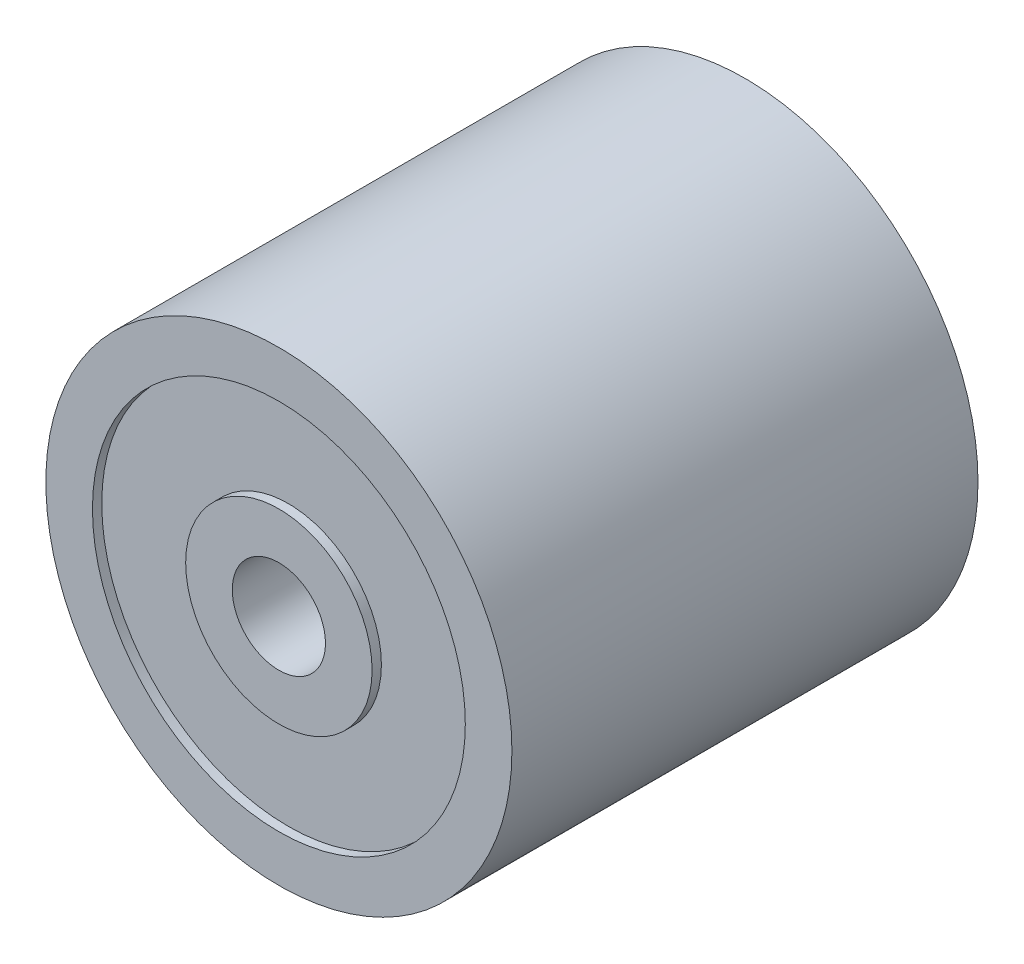
ISO-10303-21;
HEADER;
FILE_DESCRIPTION(('STEP AP214'),'2;1');
FILE_NAME('part.step','',(''),(''),'','','');
FILE_SCHEMA(('AUTOMOTIVE_DESIGN { 1 0 10303 214 1 1 1 1 }'));
ENDSEC;
DATA;
#1=APPLICATION_CONTEXT('core data for automotive mechanical design processes');
#2=APPLICATION_PROTOCOL_DEFINITION('international standard','automotive_design',2000,#1);
#3=PRODUCT_CONTEXT('',#1,'mechanical');
#4=PRODUCT('Part','Part','',(#3));
#5=PRODUCT_RELATED_PRODUCT_CATEGORY('part','',(#4));
#6=PRODUCT_DEFINITION_FORMATION('','',#4);
#7=PRODUCT_DEFINITION_CONTEXT('part definition',#1,'design');
#8=PRODUCT_DEFINITION('design','',#6,#7);
#9=PRODUCT_DEFINITION_SHAPE('','',#8);
#10=(LENGTH_UNIT() NAMED_UNIT(*) SI_UNIT(.MILLI.,.METRE.));
#11=(NAMED_UNIT(*) PLANE_ANGLE_UNIT() SI_UNIT($,.RADIAN.));
#12=(NAMED_UNIT(*) SI_UNIT($,.STERADIAN.) SOLID_ANGLE_UNIT());
#13=UNCERTAINTY_MEASURE_WITH_UNIT(LENGTH_MEASURE(1.E-05),#10,'distance_accuracy_value','');
#14=(GEOMETRIC_REPRESENTATION_CONTEXT(3) GLOBAL_UNCERTAINTY_ASSIGNED_CONTEXT((#13)) GLOBAL_UNIT_ASSIGNED_CONTEXT((#10,
#11,#12)) REPRESENTATION_CONTEXT('',''));
#15=CARTESIAN_POINT('',(0.,0.,0.));
#16=DIRECTION('',(0.,0.,1.));
#17=DIRECTION('',(1.,0.,0.));
#18=AXIS2_PLACEMENT_3D('',#15,#16,#17);
#19=CARTESIAN_POINT('',(0.,0.,0.));
#20=DIRECTION('',(0.,0.,1.));
#21=DIRECTION('',(1.,0.,0.));
#22=AXIS2_PLACEMENT_3D('',#19,#20,#21);
#23=PLANE('',#22);
#24=CARTESIAN_POINT('',(0.,0.,0.));
#25=DIRECTION('',(0.,0.,1.));
#26=DIRECTION('',(1.,0.,0.));
#27=AXIS2_PLACEMENT_3D('',#24,#25,#26);
#28=CIRCLE('',#27,1.27);
#29=CARTESIAN_POINT('',(1.27,0.,0.));
#30=VERTEX_POINT('',#29);
#31=EDGE_CURVE('E46',#30,#30,#28,.T.);
#32=ORIENTED_EDGE('',*,*,#31,.T.);
#33=EDGE_LOOP('',(#32));
#34=FACE_BOUND('',#33,.T.);
#35=CARTESIAN_POINT('',(0.,0.,0.));
#36=DIRECTION('',(0.,0.,1.));
#37=DIRECTION('',(1.,0.,0.));
#38=AXIS2_PLACEMENT_3D('',#35,#36,#37);
#39=CIRCLE('',#38,2.54);
#40=CARTESIAN_POINT('',(2.54,0.,0.));
#41=VERTEX_POINT('',#40);
#42=EDGE_CURVE('E68',#41,#41,#39,.T.);
#43=ORIENTED_EDGE('',*,*,#42,.F.);
#44=EDGE_LOOP('',(#43));
#45=FACE_BOUND('',#44,.T.);
#46=ADVANCED_FACE('F33',(#34,#45),#23,.F.);
#47=CARTESIAN_POINT('',(0.,0.,12.7));
#48=DIRECTION('',(0.,0.,1.));
#49=DIRECTION('',(1.,0.,0.));
#50=AXIS2_PLACEMENT_3D('',#47,#48,#49);
#51=PLANE('',#50);
#52=CARTESIAN_POINT('',(0.,0.,12.7));
#53=DIRECTION('',(0.,0.,1.));
#54=DIRECTION('',(1.,0.,0.));
#55=AXIS2_PLACEMENT_3D('',#52,#53,#54);
#56=CIRCLE('',#55,1.27);
#57=CARTESIAN_POINT('',(1.27,0.,12.7));
#58=VERTEX_POINT('',#57);
#59=EDGE_CURVE('E44',#58,#58,#56,.T.);
#60=ORIENTED_EDGE('',*,*,#59,.F.);
#61=EDGE_LOOP('',(#60));
#62=FACE_BOUND('',#61,.T.);
#63=CARTESIAN_POINT('',(0.,0.,12.7));
#64=DIRECTION('',(0.,0.,1.));
#65=DIRECTION('',(1.,0.,0.));
#66=AXIS2_PLACEMENT_3D('',#63,#64,#65);
#67=CIRCLE('',#66,2.54);
#68=CARTESIAN_POINT('',(2.54,0.,12.7));
#69=VERTEX_POINT('',#68);
#70=EDGE_CURVE('E56',#69,#69,#67,.T.);
#71=ORIENTED_EDGE('',*,*,#70,.T.);
#72=EDGE_LOOP('',(#71));
#73=FACE_BOUND('',#72,.T.);
#74=ADVANCED_FACE('F88',(#62,#73),#51,.T.);
#75=CARTESIAN_POINT('',(0.,0.,12.7));
#76=DIRECTION('',(0.,0.,1.));
#77=DIRECTION('',(1.,0.,0.));
#78=AXIS2_PLACEMENT_3D('',#75,#76,#77);
#79=CIRCLE('',#78,5.08);
#80=CARTESIAN_POINT('',(5.08,0.,12.7));
#81=VERTEX_POINT('',#80);
#82=EDGE_CURVE('E52',#81,#81,#79,.T.);
#83=ORIENTED_EDGE('',*,*,#82,.F.);
#84=EDGE_LOOP('',(#83));
#85=FACE_BOUND('',#84,.T.);
#86=CARTESIAN_POINT('',(0.,0.,12.7));
#87=DIRECTION('',(0.,0.,1.));
#88=DIRECTION('',(1.,0.,0.));
#89=AXIS2_PLACEMENT_3D('',#86,#87,#88);
#90=CIRCLE('',#89,6.35);
#91=CARTESIAN_POINT('',(6.35,0.,12.7));
#92=VERTEX_POINT('',#91);
#93=EDGE_CURVE('E10',#92,#92,#90,.T.);
#94=ORIENTED_EDGE('',*,*,#93,.T.);
#95=EDGE_LOOP('',(#94));
#96=FACE_BOUND('',#95,.T.);
#97=ADVANCED_FACE('F94',(#85,#96),#51,.T.);
#98=CARTESIAN_POINT('',(0.,0.,0.));
#99=DIRECTION('',(0.,0.,1.));
#100=DIRECTION('',(1.,0.,0.));
#101=AXIS2_PLACEMENT_3D('',#98,#99,#100);
#102=CIRCLE('',#101,5.08);
#103=CARTESIAN_POINT('',(5.08,0.,0.));
#104=VERTEX_POINT('',#103);
#105=EDGE_CURVE('E64',#104,#104,#102,.T.);
#106=ORIENTED_EDGE('',*,*,#105,.T.);
#107=EDGE_LOOP('',(#106));
#108=FACE_BOUND('',#107,.T.);
#109=CARTESIAN_POINT('',(0.,0.,0.));
#110=DIRECTION('',(0.,0.,1.));
#111=DIRECTION('',(1.,0.,0.));
#112=AXIS2_PLACEMENT_3D('',#109,#110,#111);
#113=CIRCLE('',#112,6.35);
#114=CARTESIAN_POINT('',(6.35,0.,0.));
#115=VERTEX_POINT('',#114);
#116=EDGE_CURVE('E37',#115,#115,#113,.T.);
#117=ORIENTED_EDGE('',*,*,#116,.F.);
#118=EDGE_LOOP('',(#117));
#119=FACE_BOUND('',#118,.T.);
#120=ADVANCED_FACE('F90',(#108,#119),#23,.F.);
#121=CARTESIAN_POINT('',(0.,0.,12.7));
#122=DIRECTION('',(0.,0.,-1.));
#123=DIRECTION('',(-1.,0.,0.));
#124=AXIS2_PLACEMENT_3D('',#121,#122,#123);
#125=CYLINDRICAL_SURFACE('',#124,6.35);
#126=ORIENTED_EDGE('',*,*,#93,.F.);
#127=EDGE_LOOP('',(#126));
#128=FACE_BOUND('',#127,.T.);
#129=ORIENTED_EDGE('',*,*,#116,.T.);
#130=EDGE_LOOP('',(#129));
#131=FACE_BOUND('',#130,.T.);
#132=ADVANCED_FACE('F35',(#128,#131),#125,.T.);
#133=CARTESIAN_POINT('',(0.,0.,12.7));
#134=DIRECTION('',(0.,0.,-1.));
#135=DIRECTION('',(-1.,0.,0.));
#136=AXIS2_PLACEMENT_3D('',#133,#134,#135);
#137=CYLINDRICAL_SURFACE('',#136,1.27);
#138=ORIENTED_EDGE('',*,*,#59,.T.);
#139=EDGE_LOOP('',(#138));
#140=FACE_BOUND('',#139,.T.);
#141=ORIENTED_EDGE('',*,*,#31,.F.);
#142=EDGE_LOOP('',(#141));
#143=FACE_BOUND('',#142,.T.);
#144=ADVANCED_FACE('F103',(#140,#143),#137,.F.);
#145=CARTESIAN_POINT('',(0.,0.,12.446));
#146=DIRECTION('',(0.,0.,1.));
#147=DIRECTION('',(1.,0.,0.));
#148=AXIS2_PLACEMENT_3D('',#145,#146,#147);
#149=CYLINDRICAL_SURFACE('',#148,2.54);
#150=CARTESIAN_POINT('',(0.,0.,12.446));
#151=DIRECTION('',(0.,0.,1.));
#152=DIRECTION('',(1.,0.,0.));
#153=AXIS2_PLACEMENT_3D('',#150,#151,#152);
#154=CIRCLE('',#153,2.54);
#155=CARTESIAN_POINT('',(2.54,0.,12.446));
#156=VERTEX_POINT('',#155);
#157=EDGE_CURVE('E55',#156,#156,#154,.T.);
#158=ORIENTED_EDGE('',*,*,#157,.T.);
#159=EDGE_LOOP('',(#158));
#160=FACE_BOUND('',#159,.T.);
#161=ORIENTED_EDGE('',*,*,#70,.F.);
#162=EDGE_LOOP('',(#161));
#163=FACE_BOUND('',#162,.T.);
#164=ADVANCED_FACE('F125',(#160,#163),#149,.T.);
#165=CARTESIAN_POINT('',(0.,0.,12.446));
#166=DIRECTION('',(0.,0.,1.));
#167=DIRECTION('',(1.,0.,0.));
#168=AXIS2_PLACEMENT_3D('',#165,#166,#167);
#169=CYLINDRICAL_SURFACE('',#168,5.08);
#170=CARTESIAN_POINT('',(0.,0.,12.446));
#171=DIRECTION('',(0.,0.,1.));
#172=DIRECTION('',(1.,0.,0.));
#173=AXIS2_PLACEMENT_3D('',#170,#171,#172);
#174=CIRCLE('',#173,5.08);
#175=CARTESIAN_POINT('',(5.08,0.,12.446));
#176=VERTEX_POINT('',#175);
#177=EDGE_CURVE('E49',#176,#176,#174,.T.);
#178=ORIENTED_EDGE('',*,*,#177,.F.);
#179=EDGE_LOOP('',(#178));
#180=FACE_BOUND('',#179,.T.);
#181=ORIENTED_EDGE('',*,*,#82,.T.);
#182=EDGE_LOOP('',(#181));
#183=FACE_BOUND('',#182,.T.);
#184=ADVANCED_FACE('F121',(#180,#183),#169,.F.);
#185=CARTESIAN_POINT('',(0.,0.,12.446));
#186=DIRECTION('',(0.,0.,1.));
#187=DIRECTION('',(1.,0.,0.));
#188=AXIS2_PLACEMENT_3D('',#185,#186,#187);
#189=PLANE('',#188);
#190=ORIENTED_EDGE('',*,*,#157,.F.);
#191=EDGE_LOOP('',(#190));
#192=FACE_BOUND('',#191,.T.);
#193=ORIENTED_EDGE('',*,*,#177,.T.);
#194=EDGE_LOOP('',(#193));
#195=FACE_BOUND('',#194,.T.);
#196=ADVANCED_FACE('F83',(#192,#195),#189,.T.);
#197=CARTESIAN_POINT('',(0.,0.,0.254));
#198=DIRECTION('',(0.,0.,-1.));
#199=DIRECTION('',(-1.,0.,0.));
#200=AXIS2_PLACEMENT_3D('',#197,#198,#199);
#201=CYLINDRICAL_SURFACE('',#200,2.54);
#202=CARTESIAN_POINT('',(0.,0.,0.254));
#203=DIRECTION('',(0.,0.,1.));
#204=DIRECTION('',(1.,0.,0.));
#205=AXIS2_PLACEMENT_3D('',#202,#203,#204);
#206=CIRCLE('',#205,2.54);
#207=CARTESIAN_POINT('',(2.54,0.,0.254));
#208=VERTEX_POINT('',#207);
#209=EDGE_CURVE('E67',#208,#208,#206,.T.);
#210=ORIENTED_EDGE('',*,*,#209,.F.);
#211=EDGE_LOOP('',(#210));
#212=FACE_BOUND('',#211,.T.);
#213=ORIENTED_EDGE('',*,*,#42,.T.);
#214=EDGE_LOOP('',(#213));
#215=FACE_BOUND('',#214,.T.);
#216=ADVANCED_FACE('F79',(#212,#215),#201,.T.);
#217=CARTESIAN_POINT('',(0.,0.,0.254));
#218=DIRECTION('',(0.,0.,-1.));
#219=DIRECTION('',(-1.,0.,0.));
#220=AXIS2_PLACEMENT_3D('',#217,#218,#219);
#221=CYLINDRICAL_SURFACE('',#220,5.08);
#222=CARTESIAN_POINT('',(0.,0.,0.254));
#223=DIRECTION('',(0.,0.,1.));
#224=DIRECTION('',(1.,0.,0.));
#225=AXIS2_PLACEMENT_3D('',#222,#223,#224);
#226=CIRCLE('',#225,5.08);
#227=CARTESIAN_POINT('',(5.08,0.,0.254));
#228=VERTEX_POINT('',#227);
#229=EDGE_CURVE('E59',#228,#228,#226,.T.);
#230=ORIENTED_EDGE('',*,*,#229,.T.);
#231=EDGE_LOOP('',(#230));
#232=FACE_BOUND('',#231,.T.);
#233=ORIENTED_EDGE('',*,*,#105,.F.);
#234=EDGE_LOOP('',(#233));
#235=FACE_BOUND('',#234,.T.);
#236=ADVANCED_FACE('F82',(#232,#235),#221,.F.);
#237=CARTESIAN_POINT('',(0.,0.,0.254));
#238=DIRECTION('',(0.,0.,-1.));
#239=DIRECTION('',(1.,0.,0.));
#240=AXIS2_PLACEMENT_3D('',#237,#238,#239);
#241=PLANE('',#240);
#242=ORIENTED_EDGE('',*,*,#209,.T.);
#243=EDGE_LOOP('',(#242));
#244=FACE_BOUND('',#243,.T.);
#245=ORIENTED_EDGE('',*,*,#229,.F.);
#246=EDGE_LOOP('',(#245));
#247=FACE_BOUND('',#246,.T.);
#248=ADVANCED_FACE('F76',(#244,#247),#241,.T.);
#249=CLOSED_SHELL('',(#46,#74,#97,#120,#132,#144,#164,#184,#196,#216,#236,#248));
#250=MANIFOLD_SOLID_BREP('B2',#249);
#251=ADVANCED_BREP_SHAPE_REPRESENTATION('',(#18,#250),#14);
#252=SHAPE_DEFINITION_REPRESENTATION(#9,#251);
ENDSEC;
END-ISO-10303-21;
